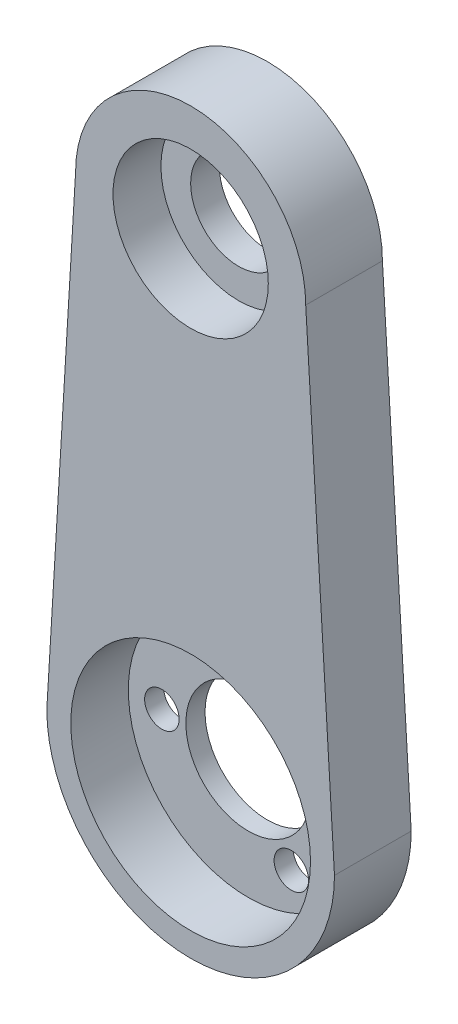
ISO-10303-21;
HEADER;
FILE_DESCRIPTION(('STEP AP214'),'2;1');
FILE_NAME('part.step','',(''),(''),'','','');
FILE_SCHEMA(('AUTOMOTIVE_DESIGN { 1 0 10303 214 1 1 1 1 }'));
ENDSEC;
DATA;
#1=APPLICATION_CONTEXT('core data for automotive mechanical design processes');
#2=APPLICATION_PROTOCOL_DEFINITION('international standard','automotive_design',2000,#1);
#3=PRODUCT_CONTEXT('',#1,'mechanical');
#4=PRODUCT('Part','Part','',(#3));
#5=PRODUCT_RELATED_PRODUCT_CATEGORY('part','',(#4));
#6=PRODUCT_DEFINITION_FORMATION('','',#4);
#7=PRODUCT_DEFINITION_CONTEXT('part definition',#1,'design');
#8=PRODUCT_DEFINITION('design','',#6,#7);
#9=PRODUCT_DEFINITION_SHAPE('','',#8);
#10=(LENGTH_UNIT() NAMED_UNIT(*) SI_UNIT(.MILLI.,.METRE.));
#11=(NAMED_UNIT(*) PLANE_ANGLE_UNIT() SI_UNIT($,.RADIAN.));
#12=(NAMED_UNIT(*) SI_UNIT($,.STERADIAN.) SOLID_ANGLE_UNIT());
#13=UNCERTAINTY_MEASURE_WITH_UNIT(LENGTH_MEASURE(1.E-05),#10,'distance_accuracy_value','');
#14=(GEOMETRIC_REPRESENTATION_CONTEXT(3) GLOBAL_UNCERTAINTY_ASSIGNED_CONTEXT((#13)) GLOBAL_UNIT_ASSIGNED_CONTEXT((#10,
#11,#12)) REPRESENTATION_CONTEXT('',''));
#15=CARTESIAN_POINT('',(0.,0.,0.));
#16=DIRECTION('',(0.,0.,1.));
#17=DIRECTION('',(1.,0.,0.));
#18=AXIS2_PLACEMENT_3D('',#15,#16,#17);
#19=CARTESIAN_POINT('',(0.,0.,-2.));
#20=DIRECTION('',(0.,0.,1.));
#21=DIRECTION('',(1.,0.,0.));
#22=AXIS2_PLACEMENT_3D('',#19,#20,#21);
#23=CYLINDRICAL_SURFACE('',#22,8.1);
#24=CARTESIAN_POINT('',(0.,0.,8.));
#25=DIRECTION('',(0.,0.,1.));
#26=DIRECTION('',(1.,0.,0.));
#27=AXIS2_PLACEMENT_3D('',#24,#25,#26);
#28=CIRCLE('',#27,8.1);
#29=CARTESIAN_POINT('',(8.1,0.,8.));
#30=VERTEX_POINT('',#29);
#31=EDGE_CURVE('E141',#30,#30,#28,.T.);
#32=ORIENTED_EDGE('',*,*,#31,.T.);
#33=EDGE_LOOP('',(#32));
#34=FACE_BOUND('',#33,.T.);
#35=CARTESIAN_POINT('',(0.,0.,3.));
#36=DIRECTION('',(0.,0.,-1.));
#37=DIRECTION('',(-1.,0.,0.));
#38=AXIS2_PLACEMENT_3D('',#35,#36,#37);
#39=CIRCLE('',#38,8.1);
#40=CARTESIAN_POINT('',(-8.1,0.,3.));
#41=VERTEX_POINT('',#40);
#42=EDGE_CURVE('E11',#41,#41,#39,.F.);
#43=ORIENTED_EDGE('',*,*,#42,.F.);
#44=EDGE_LOOP('',(#43));
#45=FACE_BOUND('',#44,.T.);
#46=ADVANCED_FACE('F38',(#34,#45),#23,.F.);
#47=CARTESIAN_POINT('',(0.,-50.,-2.));
#48=DIRECTION('',(0.,0.,1.));
#49=DIRECTION('',(1.,0.,0.));
#50=AXIS2_PLACEMENT_3D('',#47,#48,#49);
#51=CYLINDRICAL_SURFACE('',#50,6.5);
#52=CARTESIAN_POINT('',(0.,-50.,0.));
#53=DIRECTION('',(0.,0.,-1.));
#54=DIRECTION('',(-1.,0.,0.));
#55=AXIS2_PLACEMENT_3D('',#52,#53,#54);
#56=CIRCLE('',#55,6.5);
#57=CARTESIAN_POINT('',(-6.49999999999999,-50.,0.));
#58=VERTEX_POINT('',#57);
#59=EDGE_CURVE('E108',#58,#58,#56,.T.);
#60=ORIENTED_EDGE('',*,*,#59,.T.);
#61=EDGE_LOOP('',(#60));
#62=FACE_BOUND('',#61,.T.);
#63=CARTESIAN_POINT('',(0.,-50.,2.));
#64=DIRECTION('',(0.,0.,1.));
#65=DIRECTION('',(1.,0.,0.));
#66=AXIS2_PLACEMENT_3D('',#63,#64,#65);
#67=CIRCLE('',#66,6.5);
#68=CARTESIAN_POINT('',(6.50000000000001,-50.,2.));
#69=VERTEX_POINT('',#68);
#70=EDGE_CURVE('E122',#69,#69,#67,.F.);
#71=ORIENTED_EDGE('',*,*,#70,.F.);
#72=EDGE_LOOP('',(#71));
#73=FACE_BOUND('',#72,.T.);
#74=ADVANCED_FACE('F153',(#62,#73),#51,.F.);
#75=CARTESIAN_POINT('',(-8.99999999999999,-50.,-2.));
#76=DIRECTION('',(0.,0.,1.));
#77=DIRECTION('',(1.,0.,0.));
#78=AXIS2_PLACEMENT_3D('',#75,#76,#77);
#79=CYLINDRICAL_SURFACE('',#78,1.8);
#80=CARTESIAN_POINT('',(-8.99999999999999,-50.,0.));
#81=DIRECTION('',(0.,0.,-1.));
#82=DIRECTION('',(-1.,0.,0.));
#83=AXIS2_PLACEMENT_3D('',#80,#81,#82);
#84=CIRCLE('',#83,1.8);
#85=CARTESIAN_POINT('',(-10.8,-50.,0.));
#86=VERTEX_POINT('',#85);
#87=EDGE_CURVE('E118',#86,#86,#84,.T.);
#88=ORIENTED_EDGE('',*,*,#87,.T.);
#89=EDGE_LOOP('',(#88));
#90=FACE_BOUND('',#89,.T.);
#91=CARTESIAN_POINT('',(-8.99999999999999,-50.,2.));
#92=DIRECTION('',(0.,0.,1.));
#93=DIRECTION('',(1.,0.,0.));
#94=AXIS2_PLACEMENT_3D('',#91,#92,#93);
#95=CIRCLE('',#94,1.8);
#96=CARTESIAN_POINT('',(-7.19999999999999,-50.,2.));
#97=VERTEX_POINT('',#96);
#98=EDGE_CURVE('E133',#97,#97,#95,.F.);
#99=ORIENTED_EDGE('',*,*,#98,.F.);
#100=EDGE_LOOP('',(#99));
#101=FACE_BOUND('',#100,.T.);
#102=ADVANCED_FACE('F155',(#90,#101),#79,.F.);
#103=CARTESIAN_POINT('',(4.5000000000001,-57.7942286340599,-2.));
#104=DIRECTION('',(0.,0.,1.));
#105=DIRECTION('',(1.,0.,0.));
#106=AXIS2_PLACEMENT_3D('',#103,#104,#105);
#107=CYLINDRICAL_SURFACE('',#106,1.8);
#108=CARTESIAN_POINT('',(4.5000000000001,-57.7942286340599,0.));
#109=DIRECTION('',(0.,0.,-1.));
#110=DIRECTION('',(-1.,0.,0.));
#111=AXIS2_PLACEMENT_3D('',#108,#109,#110);
#112=CIRCLE('',#111,1.8);
#113=CARTESIAN_POINT('',(2.7000000000001,-57.7942286340599,0.));
#114=VERTEX_POINT('',#113);
#115=EDGE_CURVE('E121',#114,#114,#112,.T.);
#116=ORIENTED_EDGE('',*,*,#115,.T.);
#117=EDGE_LOOP('',(#116));
#118=FACE_BOUND('',#117,.T.);
#119=CARTESIAN_POINT('',(4.5000000000001,-57.7942286340599,2.));
#120=DIRECTION('',(0.,0.,1.));
#121=DIRECTION('',(1.,0.,0.));
#122=AXIS2_PLACEMENT_3D('',#119,#120,#121);
#123=CIRCLE('',#122,1.8);
#124=CARTESIAN_POINT('',(6.3000000000001,-57.7942286340599,2.));
#125=VERTEX_POINT('',#124);
#126=EDGE_CURVE('E128',#125,#125,#123,.F.);
#127=ORIENTED_EDGE('',*,*,#126,.F.);
#128=EDGE_LOOP('',(#127));
#129=FACE_BOUND('',#128,.T.);
#130=ADVANCED_FACE('F162',(#118,#129),#107,.F.);
#131=CARTESIAN_POINT('',(4.49999999999999,-42.20577136594,-2.));
#132=DIRECTION('',(0.,0.,1.));
#133=DIRECTION('',(1.,0.,0.));
#134=AXIS2_PLACEMENT_3D('',#131,#132,#133);
#135=CYLINDRICAL_SURFACE('',#134,1.8);
#136=CARTESIAN_POINT('',(4.49999999999999,-42.20577136594,0.));
#137=DIRECTION('',(0.,0.,-1.));
#138=DIRECTION('',(-1.,0.,0.));
#139=AXIS2_PLACEMENT_3D('',#136,#137,#138);
#140=CIRCLE('',#139,1.8);
#141=CARTESIAN_POINT('',(2.69999999999998,-42.20577136594,0.));
#142=VERTEX_POINT('',#141);
#143=EDGE_CURVE('E117',#142,#142,#140,.T.);
#144=ORIENTED_EDGE('',*,*,#143,.T.);
#145=EDGE_LOOP('',(#144));
#146=FACE_BOUND('',#145,.T.);
#147=CARTESIAN_POINT('',(4.49999999999999,-42.20577136594,2.));
#148=DIRECTION('',(0.,0.,1.));
#149=DIRECTION('',(1.,0.,0.));
#150=AXIS2_PLACEMENT_3D('',#147,#148,#149);
#151=CIRCLE('',#150,1.8);
#152=CARTESIAN_POINT('',(6.29999999999999,-42.20577136594,2.));
#153=VERTEX_POINT('',#152);
#154=EDGE_CURVE('E126',#153,#153,#151,.F.);
#155=ORIENTED_EDGE('',*,*,#154,.F.);
#156=EDGE_LOOP('',(#155));
#157=FACE_BOUND('',#156,.T.);
#158=ADVANCED_FACE('F184',(#146,#157),#135,.F.);
#159=CARTESIAN_POINT('',(0.,0.,8.));
#160=DIRECTION('',(0.,0.,-1.));
#161=DIRECTION('',(-1.,0.,0.));
#162=AXIS2_PLACEMENT_3D('',#159,#160,#161);
#163=CYLINDRICAL_SURFACE('',#162,12.);
#164=CARTESIAN_POINT('',(0.,0.,0.));
#165=DIRECTION('',(0.,0.,1.));
#166=DIRECTION('',(-1.,0.,0.));
#167=AXIS2_PLACEMENT_3D('',#164,#165,#166);
#168=CIRCLE('',#167,12.);
#169=CARTESIAN_POINT('',(12.,0.,0.));
#170=VERTEX_POINT('',#169);
#171=CARTESIAN_POINT('',(-12.,0.,0.));
#172=VERTEX_POINT('',#171);
#173=EDGE_CURVE('E105',#170,#172,#168,.T.);
#174=ORIENTED_EDGE('',*,*,#173,.T.);
#175=DIRECTION('',(0.,0.,-1.));
#176=VECTOR('',#175,1.);
#177=CARTESIAN_POINT('',(-12.,0.,8.));
#178=LINE('',#177,#176);
#179=CARTESIAN_POINT('',(-12.,0.,8.));
#180=VERTEX_POINT('',#179);
#181=EDGE_CURVE('E47',#180,#172,#178,.T.);
#182=ORIENTED_EDGE('',*,*,#181,.F.);
#183=CARTESIAN_POINT('',(0.,0.,8.));
#184=DIRECTION('',(0.,0.,1.));
#185=DIRECTION('',(-1.,0.,0.));
#186=AXIS2_PLACEMENT_3D('',#183,#184,#185);
#187=CIRCLE('',#186,12.);
#188=CARTESIAN_POINT('',(12.,0.,8.));
#189=VERTEX_POINT('',#188);
#190=EDGE_CURVE('E91',#189,#180,#187,.T.);
#191=ORIENTED_EDGE('',*,*,#190,.F.);
#192=DIRECTION('',(0.,0.,-1.));
#193=VECTOR('',#192,1.);
#194=CARTESIAN_POINT('',(12.,0.,8.));
#195=LINE('',#194,#193);
#196=EDGE_CURVE('E101',#189,#170,#195,.T.);
#197=ORIENTED_EDGE('',*,*,#196,.T.);
#198=EDGE_LOOP('',(#174,#182,#191,#197));
#199=FACE_BOUND('',#198,.T.);
#200=ADVANCED_FACE('F40',(#199),#163,.T.);
#201=CARTESIAN_POINT('',(-12.,0.,8.));
#202=DIRECTION('',(0.998204845465779,-0.0598922907279466,0.));
#203=DIRECTION('',(0.0598922907279466,0.998204845465779,0.));
#204=AXIS2_PLACEMENT_3D('',#201,#202,#203);
#205=PLANE('',#204);
#206=DIRECTION('',(-0.0598922907279466,-0.998204845465779,0.));
#207=VECTOR('',#206,1.);
#208=CARTESIAN_POINT('',(-12.,0.,0.));
#209=LINE('',#208,#207);
#210=CARTESIAN_POINT('',(-15.,-50.,0.));
#211=VERTEX_POINT('',#210);
#212=EDGE_CURVE('E96',#172,#211,#209,.T.);
#213=ORIENTED_EDGE('',*,*,#212,.T.);
#214=DIRECTION('',(0.,0.,-1.));
#215=VECTOR('',#214,1.);
#216=CARTESIAN_POINT('',(-15.,-50.,8.));
#217=LINE('',#216,#215);
#218=CARTESIAN_POINT('',(-15.,-50.,8.));
#219=VERTEX_POINT('',#218);
#220=EDGE_CURVE('E94',#219,#211,#217,.T.);
#221=ORIENTED_EDGE('',*,*,#220,.F.);
#222=DIRECTION('',(-0.0598922907279466,-0.998204845465779,0.));
#223=VECTOR('',#222,1.);
#224=CARTESIAN_POINT('',(-12.,0.,8.));
#225=LINE('',#224,#223);
#226=EDGE_CURVE('E86',#180,#219,#225,.T.);
#227=ORIENTED_EDGE('',*,*,#226,.F.);
#228=ORIENTED_EDGE('',*,*,#181,.T.);
#229=EDGE_LOOP('',(#213,#221,#227,#228));
#230=FACE_BOUND('',#229,.T.);
#231=ADVANCED_FACE('F95',(#230),#205,.F.);
#232=CARTESIAN_POINT('',(0.,-50.,8.));
#233=DIRECTION('',(0.,0.,-1.));
#234=DIRECTION('',(-1.,0.,0.));
#235=AXIS2_PLACEMENT_3D('',#232,#233,#234);
#236=CYLINDRICAL_SURFACE('',#235,15.);
#237=CARTESIAN_POINT('',(0.,-50.,0.));
#238=DIRECTION('',(0.,0.,1.));
#239=DIRECTION('',(1.,0.,0.));
#240=AXIS2_PLACEMENT_3D('',#237,#238,#239);
#241=CIRCLE('',#240,15.);
#242=CARTESIAN_POINT('',(15.,-50.,0.));
#243=VERTEX_POINT('',#242);
#244=EDGE_CURVE('E72',#211,#243,#241,.T.);
#245=ORIENTED_EDGE('',*,*,#244,.T.);
#246=DIRECTION('',(0.,0.,-1.));
#247=VECTOR('',#246,1.);
#248=CARTESIAN_POINT('',(15.,-50.,8.));
#249=LINE('',#248,#247);
#250=CARTESIAN_POINT('',(15.,-50.,8.));
#251=VERTEX_POINT('',#250);
#252=EDGE_CURVE('E97',#251,#243,#249,.T.);
#253=ORIENTED_EDGE('',*,*,#252,.F.);
#254=CARTESIAN_POINT('',(0.,-50.,8.));
#255=DIRECTION('',(0.,0.,1.));
#256=DIRECTION('',(1.,0.,0.));
#257=AXIS2_PLACEMENT_3D('',#254,#255,#256);
#258=CIRCLE('',#257,15.);
#259=EDGE_CURVE('E89',#219,#251,#258,.T.);
#260=ORIENTED_EDGE('',*,*,#259,.F.);
#261=ORIENTED_EDGE('',*,*,#220,.T.);
#262=EDGE_LOOP('',(#245,#253,#260,#261));
#263=FACE_BOUND('',#262,.T.);
#264=ADVANCED_FACE('F99',(#263),#236,.T.);
#265=CARTESIAN_POINT('',(12.,0.,8.));
#266=DIRECTION('',(-0.998204845465779,-0.0598922907279466,0.));
#267=DIRECTION('',(0.0598922907279466,-0.998204845465779,0.));
#268=AXIS2_PLACEMENT_3D('',#265,#266,#267);
#269=PLANE('',#268);
#270=DIRECTION('',(-0.0598922907279466,0.998204845465779,0.));
#271=VECTOR('',#270,1.);
#272=CARTESIAN_POINT('',(12.,0.,0.));
#273=LINE('',#272,#271);
#274=EDGE_CURVE('E78',#243,#170,#273,.T.);
#275=ORIENTED_EDGE('',*,*,#274,.T.);
#276=ORIENTED_EDGE('',*,*,#196,.F.);
#277=DIRECTION('',(-0.0598922907279466,0.998204845465779,0.));
#278=VECTOR('',#277,1.);
#279=CARTESIAN_POINT('',(12.,0.,8.));
#280=LINE('',#279,#278);
#281=EDGE_CURVE('E55',#251,#189,#280,.T.);
#282=ORIENTED_EDGE('',*,*,#281,.F.);
#283=ORIENTED_EDGE('',*,*,#252,.T.);
#284=EDGE_LOOP('',(#275,#276,#282,#283));
#285=FACE_BOUND('',#284,.T.);
#286=ADVANCED_FACE('F172',(#285),#269,.F.);
#287=CARTESIAN_POINT('',(0.,0.,8.));
#288=DIRECTION('',(0.,0.,-1.));
#289=DIRECTION('',(-1.,0.,0.));
#290=AXIS2_PLACEMENT_3D('',#287,#288,#289);
#291=PLANE('',#290);
#292=ORIENTED_EDGE('',*,*,#31,.F.);
#293=EDGE_LOOP('',(#292));
#294=FACE_BOUND('',#293,.T.);
#295=CARTESIAN_POINT('',(0.,-50.,8.));
#296=DIRECTION('',(0.,0.,1.));
#297=DIRECTION('',(1.,0.,0.));
#298=AXIS2_PLACEMENT_3D('',#295,#296,#297);
#299=CIRCLE('',#298,12.5);
#300=CARTESIAN_POINT('',(12.5,-50.,8.));
#301=VERTEX_POINT('',#300);
#302=EDGE_CURVE('E136',#301,#301,#299,.T.);
#303=ORIENTED_EDGE('',*,*,#302,.F.);
#304=EDGE_LOOP('',(#303));
#305=FACE_BOUND('',#304,.T.);
#306=ORIENTED_EDGE('',*,*,#190,.T.);
#307=ORIENTED_EDGE('',*,*,#226,.T.);
#308=ORIENTED_EDGE('',*,*,#259,.T.);
#309=ORIENTED_EDGE('',*,*,#281,.T.);
#310=EDGE_LOOP('',(#306,#307,#308,#309));
#311=FACE_BOUND('',#310,.T.);
#312=ADVANCED_FACE('F87',(#294,#305,#311),#291,.F.);
#313=CARTESIAN_POINT('',(0.,0.,0.));
#314=DIRECTION('',(0.,0.,-1.));
#315=DIRECTION('',(-1.,0.,0.));
#316=AXIS2_PLACEMENT_3D('',#313,#314,#315);
#317=PLANE('',#316);
#318=ORIENTED_EDGE('',*,*,#143,.F.);
#319=EDGE_LOOP('',(#318));
#320=FACE_BOUND('',#319,.T.);
#321=ORIENTED_EDGE('',*,*,#115,.F.);
#322=EDGE_LOOP('',(#321));
#323=FACE_BOUND('',#322,.T.);
#324=ORIENTED_EDGE('',*,*,#87,.F.);
#325=EDGE_LOOP('',(#324));
#326=FACE_BOUND('',#325,.T.);
#327=ORIENTED_EDGE('',*,*,#59,.F.);
#328=EDGE_LOOP('',(#327));
#329=FACE_BOUND('',#328,.T.);
#330=ORIENTED_EDGE('',*,*,#173,.F.);
#331=ORIENTED_EDGE('',*,*,#274,.F.);
#332=ORIENTED_EDGE('',*,*,#244,.F.);
#333=ORIENTED_EDGE('',*,*,#212,.F.);
#334=EDGE_LOOP('',(#330,#331,#332,#333));
#335=FACE_BOUND('',#334,.T.);
#336=CARTESIAN_POINT('',(0.,0.,0.));
#337=DIRECTION('',(0.,0.,-1.));
#338=DIRECTION('',(-1.,0.,0.));
#339=AXIS2_PLACEMENT_3D('',#336,#337,#338);
#340=CIRCLE('',#339,5.);
#341=CARTESIAN_POINT('',(-5.,0.,0.));
#342=VERTEX_POINT('',#341);
#343=EDGE_CURVE('E196',#342,#342,#340,.T.);
#344=ORIENTED_EDGE('',*,*,#343,.F.);
#345=EDGE_LOOP('',(#344));
#346=FACE_BOUND('',#345,.T.);
#347=ADVANCED_FACE('F171',(#320,#323,#326,#329,#335,#346),#317,.T.);
#348=CARTESIAN_POINT('',(0.,-50.,2.));
#349=DIRECTION('',(0.,0.,1.));
#350=DIRECTION('',(1.,0.,0.));
#351=AXIS2_PLACEMENT_3D('',#348,#349,#350);
#352=PLANE('',#351);
#353=CARTESIAN_POINT('',(0.,-50.,2.));
#354=DIRECTION('',(0.,0.,1.));
#355=DIRECTION('',(1.,0.,0.));
#356=AXIS2_PLACEMENT_3D('',#353,#354,#355);
#357=CIRCLE('',#356,12.5);
#358=CARTESIAN_POINT('',(12.5,-50.,2.));
#359=VERTEX_POINT('',#358);
#360=EDGE_CURVE('E129',#359,#359,#357,.T.);
#361=ORIENTED_EDGE('',*,*,#360,.T.);
#362=EDGE_LOOP('',(#361));
#363=FACE_BOUND('',#362,.T.);
#364=ORIENTED_EDGE('',*,*,#154,.T.);
#365=EDGE_LOOP('',(#364));
#366=FACE_BOUND('',#365,.T.);
#367=ORIENTED_EDGE('',*,*,#126,.T.);
#368=EDGE_LOOP('',(#367));
#369=FACE_BOUND('',#368,.T.);
#370=ORIENTED_EDGE('',*,*,#98,.T.);
#371=EDGE_LOOP('',(#370));
#372=FACE_BOUND('',#371,.T.);
#373=ORIENTED_EDGE('',*,*,#70,.T.);
#374=EDGE_LOOP('',(#373));
#375=FACE_BOUND('',#374,.T.);
#376=ADVANCED_FACE('F151',(#363,#366,#369,#372,#375),#352,.T.);
#377=CARTESIAN_POINT('',(0.,-50.,2.));
#378=DIRECTION('',(0.,0.,1.));
#379=DIRECTION('',(1.,0.,0.));
#380=AXIS2_PLACEMENT_3D('',#377,#378,#379);
#381=CYLINDRICAL_SURFACE('',#380,12.5);
#382=ORIENTED_EDGE('',*,*,#360,.F.);
#383=EDGE_LOOP('',(#382));
#384=FACE_BOUND('',#383,.T.);
#385=ORIENTED_EDGE('',*,*,#302,.T.);
#386=EDGE_LOOP('',(#385));
#387=FACE_BOUND('',#386,.T.);
#388=ADVANCED_FACE('F209',(#384,#387),#381,.F.);
#389=CARTESIAN_POINT('',(0.,0.,3.));
#390=DIRECTION('',(0.,0.,-1.));
#391=DIRECTION('',(-1.,0.,0.));
#392=AXIS2_PLACEMENT_3D('',#389,#390,#391);
#393=PLANE('',#392);
#394=CARTESIAN_POINT('',(0.,0.,3.));
#395=DIRECTION('',(0.,0.,-1.));
#396=DIRECTION('',(-1.,0.,0.));
#397=AXIS2_PLACEMENT_3D('',#394,#395,#396);
#398=CIRCLE('',#397,5.);
#399=CARTESIAN_POINT('',(-5.,0.,3.));
#400=VERTEX_POINT('',#399);
#401=EDGE_CURVE('E198',#400,#400,#398,.T.);
#402=ORIENTED_EDGE('',*,*,#401,.T.);
#403=EDGE_LOOP('',(#402));
#404=FACE_BOUND('',#403,.T.);
#405=ORIENTED_EDGE('',*,*,#42,.T.);
#406=EDGE_LOOP('',(#405));
#407=FACE_BOUND('',#406,.T.);
#408=ADVANCED_FACE('F211',(#404,#407),#393,.F.);
#409=CARTESIAN_POINT('',(0.,0.,3.));
#410=DIRECTION('',(0.,0.,-1.));
#411=DIRECTION('',(-1.,0.,0.));
#412=AXIS2_PLACEMENT_3D('',#409,#410,#411);
#413=CYLINDRICAL_SURFACE('',#412,5.);
#414=ORIENTED_EDGE('',*,*,#401,.F.);
#415=EDGE_LOOP('',(#414));
#416=FACE_BOUND('',#415,.T.);
#417=ORIENTED_EDGE('',*,*,#343,.T.);
#418=EDGE_LOOP('',(#417));
#419=FACE_BOUND('',#418,.T.);
#420=ADVANCED_FACE('F218',(#416,#419),#413,.F.);
#421=CLOSED_SHELL('',(#46,#74,#102,#130,#158,#200,#231,#264,#286,#312,#347,#376,#388,#408,#420));
#422=MANIFOLD_SOLID_BREP('B2',#421);
#423=ADVANCED_BREP_SHAPE_REPRESENTATION('',(#18,#422),#14);
#424=SHAPE_DEFINITION_REPRESENTATION(#9,#423);
ENDSEC;
END-ISO-10303-21;
